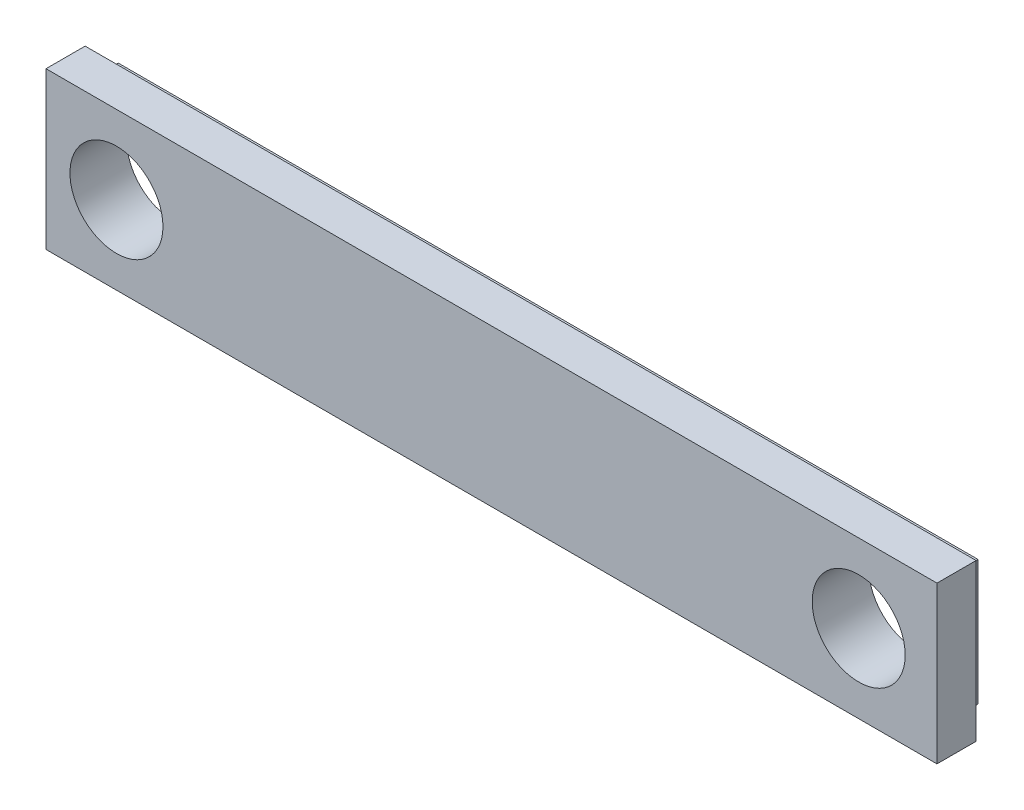
ISO-10303-21;
HEADER;
FILE_DESCRIPTION(('STEP AP214'),'2;1');
FILE_NAME('part.step','',(''),(''),'','','');
FILE_SCHEMA(('AUTOMOTIVE_DESIGN { 1 0 10303 214 1 1 1 1 }'));
ENDSEC;
DATA;
#1=APPLICATION_CONTEXT('core data for automotive mechanical design processes');
#2=APPLICATION_PROTOCOL_DEFINITION('international standard','automotive_design',2000,#1);
#3=PRODUCT_CONTEXT('',#1,'mechanical');
#4=PRODUCT('Part','Part','',(#3));
#5=PRODUCT_RELATED_PRODUCT_CATEGORY('part','',(#4));
#6=PRODUCT_DEFINITION_FORMATION('','',#4);
#7=PRODUCT_DEFINITION_CONTEXT('part definition',#1,'design');
#8=PRODUCT_DEFINITION('design','',#6,#7);
#9=PRODUCT_DEFINITION_SHAPE('','',#8);
#10=(LENGTH_UNIT() NAMED_UNIT(*) SI_UNIT(.MILLI.,.METRE.));
#11=(NAMED_UNIT(*) PLANE_ANGLE_UNIT() SI_UNIT($,.RADIAN.));
#12=(NAMED_UNIT(*) SI_UNIT($,.STERADIAN.) SOLID_ANGLE_UNIT());
#13=UNCERTAINTY_MEASURE_WITH_UNIT(LENGTH_MEASURE(1.E-05),#10,'distance_accuracy_value','');
#14=(GEOMETRIC_REPRESENTATION_CONTEXT(3) GLOBAL_UNCERTAINTY_ASSIGNED_CONTEXT((#13)) GLOBAL_UNIT_ASSIGNED_CONTEXT((#10,
#11,#12)) REPRESENTATION_CONTEXT('',''));
#15=CARTESIAN_POINT('',(0.,0.,0.));
#16=DIRECTION('',(0.,0.,1.));
#17=DIRECTION('',(1.,0.,0.));
#18=AXIS2_PLACEMENT_3D('',#15,#16,#17);
#19=CARTESIAN_POINT('',(0.,0.,0.));
#20=DIRECTION('',(0.,0.,-1.));
#21=DIRECTION('',(-1.,0.,0.));
#22=AXIS2_PLACEMENT_3D('',#19,#20,#21);
#23=PLANE('',#22);
#24=CARTESIAN_POINT('',(-165.899999999998,5.99999999999508,0.));
#25=DIRECTION('',(0.,0.,1.));
#26=DIRECTION('',(1.,0.,0.));
#27=AXIS2_PLACEMENT_3D('',#24,#25,#26);
#28=CIRCLE('',#27,2.96999999999999);
#29=CARTESIAN_POINT('',(-162.929999999998,5.99999999999508,0.));
#30=VERTEX_POINT('',#29);
#31=EDGE_CURVE('E185',#30,#30,#28,.T.);
#32=ORIENTED_EDGE('',*,*,#31,.T.);
#33=EDGE_LOOP('',(#32));
#34=FACE_BOUND('',#33,.T.);
#35=DIRECTION('',(0.,1.,0.));
#36=VECTOR('',#35,1.);
#37=CARTESIAN_POINT('',(-161.899999999997,9.99999999999508,0.));
#38=LINE('',#37,#36);
#39=CARTESIAN_POINT('',(-161.899999999997,2.00000000000389,0.));
#40=VERTEX_POINT('',#39);
#41=CARTESIAN_POINT('',(-161.899999999997,9.99999999999508,0.));
#42=VERTEX_POINT('',#41);
#43=EDGE_CURVE('E188',#40,#42,#38,.T.);
#44=ORIENTED_EDGE('',*,*,#43,.F.);
#45=DIRECTION('',(1.,0.,0.));
#46=VECTOR('',#45,1.);
#47=CARTESIAN_POINT('',(-161.899999999997,2.00000000000389,0.));
#48=LINE('',#47,#46);
#49=CARTESIAN_POINT('',(-216.799999999998,2.00000000000389,0.));
#50=VERTEX_POINT('',#49);
#51=EDGE_CURVE('E101',#50,#40,#48,.T.);
#52=ORIENTED_EDGE('',*,*,#51,.F.);
#53=DIRECTION('',(0.,-1.,0.));
#54=VECTOR('',#53,1.);
#55=CARTESIAN_POINT('',(-216.799999999998,9.99999999999504,0.));
#56=LINE('',#55,#54);
#57=CARTESIAN_POINT('',(-216.799999999998,9.99999999999504,0.));
#58=VERTEX_POINT('',#57);
#59=EDGE_CURVE('E96',#58,#50,#56,.T.);
#60=ORIENTED_EDGE('',*,*,#59,.F.);
#61=DIRECTION('',(-1.,0.,0.));
#62=VECTOR('',#61,1.);
#63=CARTESIAN_POINT('',(-161.899999999997,9.99999999999508,0.));
#64=LINE('',#63,#62);
#65=EDGE_CURVE('E202',#42,#58,#64,.T.);
#66=ORIENTED_EDGE('',*,*,#65,.F.);
#67=EDGE_LOOP('',(#44,#52,#60,#66));
#68=FACE_BOUND('',#67,.T.);
#69=CARTESIAN_POINT('',(-213.299999999998,6.00000000000389,0.));
#70=DIRECTION('',(0.,0.,1.));
#71=DIRECTION('',(1.,0.,0.));
#72=AXIS2_PLACEMENT_3D('',#69,#70,#71);
#73=CIRCLE('',#72,2.969999999997);
#74=CARTESIAN_POINT('',(-210.330000000001,6.00000000000389,0.));
#75=VERTEX_POINT('',#74);
#76=EDGE_CURVE('E178',#75,#75,#73,.T.);
#77=ORIENTED_EDGE('',*,*,#76,.T.);
#78=EDGE_LOOP('',(#77));
#79=FACE_BOUND('',#78,.T.);
#80=ADVANCED_FACE('F63',(#34,#68,#79),#23,.T.);
#81=CARTESIAN_POINT('',(-161.899999999997,9.99999999999508,1.12));
#82=DIRECTION('',(-1.,0.,0.));
#83=DIRECTION('',(0.,0.,1.));
#84=AXIS2_PLACEMENT_3D('',#81,#82,#83);
#85=PLANE('',#84);
#86=ORIENTED_EDGE('',*,*,#43,.T.);
#87=DIRECTION('',(0.,0.,-1.));
#88=VECTOR('',#87,1.);
#89=CARTESIAN_POINT('',(-161.899999999997,9.99999999999508,1.12));
#90=LINE('',#89,#88);
#91=CARTESIAN_POINT('',(-161.899999999997,9.99999999999508,1.12));
#92=VERTEX_POINT('',#91);
#93=EDGE_CURVE('E12',#92,#42,#90,.T.);
#94=ORIENTED_EDGE('',*,*,#93,.F.);
#95=DIRECTION('',(0.,1.,0.));
#96=VECTOR('',#95,1.);
#97=CARTESIAN_POINT('',(-161.899999999997,9.99999999999508,1.12));
#98=LINE('',#97,#96);
#99=CARTESIAN_POINT('',(-161.899999999997,2.00000000000389,1.12));
#100=VERTEX_POINT('',#99);
#101=EDGE_CURVE('E189',#100,#92,#98,.T.);
#102=ORIENTED_EDGE('',*,*,#101,.F.);
#103=DIRECTION('',(0.,0.,-1.));
#104=VECTOR('',#103,1.);
#105=CARTESIAN_POINT('',(-161.899999999997,2.00000000000389,1.12));
#106=LINE('',#105,#104);
#107=EDGE_CURVE('E199',#100,#40,#106,.T.);
#108=ORIENTED_EDGE('',*,*,#107,.T.);
#109=EDGE_LOOP('',(#86,#94,#102,#108));
#110=FACE_BOUND('',#109,.T.);
#111=ADVANCED_FACE('F65',(#110),#85,.F.);
#112=CARTESIAN_POINT('',(-161.899999999997,9.99999999999508,1.12));
#113=DIRECTION('',(0.,-1.,0.));
#114=DIRECTION('',(1.,0.,0.));
#115=AXIS2_PLACEMENT_3D('',#112,#113,#114);
#116=PLANE('',#115);
#117=ORIENTED_EDGE('',*,*,#65,.T.);
#118=DIRECTION('',(0.,0.,-1.));
#119=VECTOR('',#118,1.);
#120=CARTESIAN_POINT('',(-216.799999999998,9.99999999999504,1.12));
#121=LINE('',#120,#119);
#122=CARTESIAN_POINT('',(-216.799999999998,9.99999999999504,1.12));
#123=VERTEX_POINT('',#122);
#124=EDGE_CURVE('E72',#123,#58,#121,.T.);
#125=ORIENTED_EDGE('',*,*,#124,.F.);
#126=DIRECTION('',(-1.,0.,0.));
#127=VECTOR('',#126,1.);
#128=CARTESIAN_POINT('',(-161.899999999997,9.99999999999508,1.12));
#129=LINE('',#128,#127);
#130=EDGE_CURVE('E106',#92,#123,#129,.T.);
#131=ORIENTED_EDGE('',*,*,#130,.F.);
#132=ORIENTED_EDGE('',*,*,#93,.T.);
#133=EDGE_LOOP('',(#117,#125,#131,#132));
#134=FACE_BOUND('',#133,.T.);
#135=ADVANCED_FACE('F239',(#134),#116,.F.);
#136=CARTESIAN_POINT('',(-216.799999999998,9.99999999999504,1.12));
#137=DIRECTION('',(1.,0.,0.));
#138=DIRECTION('',(0.,0.,-1.));
#139=AXIS2_PLACEMENT_3D('',#136,#137,#138);
#140=PLANE('',#139);
#141=ORIENTED_EDGE('',*,*,#59,.T.);
#142=DIRECTION('',(0.,0.,-1.));
#143=VECTOR('',#142,1.);
#144=CARTESIAN_POINT('',(-216.799999999998,2.00000000000389,1.12));
#145=LINE('',#144,#143);
#146=CARTESIAN_POINT('',(-216.799999999998,2.00000000000389,1.12));
#147=VERTEX_POINT('',#146);
#148=EDGE_CURVE('E80',#147,#50,#145,.T.);
#149=ORIENTED_EDGE('',*,*,#148,.F.);
#150=DIRECTION('',(0.,-1.,0.));
#151=VECTOR('',#150,1.);
#152=CARTESIAN_POINT('',(-216.799999999998,9.99999999999504,1.12));
#153=LINE('',#152,#151);
#154=EDGE_CURVE('E193',#123,#147,#153,.T.);
#155=ORIENTED_EDGE('',*,*,#154,.F.);
#156=ORIENTED_EDGE('',*,*,#124,.T.);
#157=EDGE_LOOP('',(#141,#149,#155,#156));
#158=FACE_BOUND('',#157,.T.);
#159=ADVANCED_FACE('F207',(#158),#140,.F.);
#160=CARTESIAN_POINT('',(-161.899999999997,2.00000000000389,1.12));
#161=DIRECTION('',(0.,1.,0.));
#162=DIRECTION('',(-1.,0.,0.));
#163=AXIS2_PLACEMENT_3D('',#160,#161,#162);
#164=PLANE('',#163);
#165=ORIENTED_EDGE('',*,*,#51,.T.);
#166=ORIENTED_EDGE('',*,*,#107,.F.);
#167=DIRECTION('',(1.,0.,0.));
#168=VECTOR('',#167,1.);
#169=CARTESIAN_POINT('',(-161.899999999997,2.00000000000389,1.12));
#170=LINE('',#169,#168);
#171=EDGE_CURVE('E196',#147,#100,#170,.T.);
#172=ORIENTED_EDGE('',*,*,#171,.F.);
#173=ORIENTED_EDGE('',*,*,#148,.T.);
#174=EDGE_LOOP('',(#165,#166,#172,#173));
#175=FACE_BOUND('',#174,.T.);
#176=ADVANCED_FACE('F212',(#175),#164,.F.);
#177=CARTESIAN_POINT('',(-165.899999999998,5.99999999999508,1.12));
#178=DIRECTION('',(0.,0.,-1.));
#179=DIRECTION('',(-1.,0.,0.));
#180=AXIS2_PLACEMENT_3D('',#177,#178,#179);
#181=CYLINDRICAL_SURFACE('',#180,2.96999999999999);
#182=ORIENTED_EDGE('',*,*,#31,.F.);
#183=EDGE_LOOP('',(#182));
#184=FACE_BOUND('',#183,.T.);
#185=CARTESIAN_POINT('',(-165.899999999998,5.99999999999508,3.62));
#186=DIRECTION('',(0.,0.,1.));
#187=DIRECTION('',(1.,0.,0.));
#188=AXIS2_PLACEMENT_3D('',#185,#186,#187);
#189=CIRCLE('',#188,2.969999999997);
#190=CARTESIAN_POINT('',(-162.93,5.99999999999508,3.62));
#191=VERTEX_POINT('',#190);
#192=EDGE_CURVE('E341',#191,#191,#189,.T.);
#193=ORIENTED_EDGE('',*,*,#192,.T.);
#194=EDGE_LOOP('',(#193));
#195=FACE_BOUND('',#194,.T.);
#196=ADVANCED_FACE('F242',(#184,#195),#181,.F.);
#197=CARTESIAN_POINT('',(-213.299999999998,6.00000000000389,1.12));
#198=DIRECTION('',(0.,0.,-1.));
#199=DIRECTION('',(-1.,0.,0.));
#200=AXIS2_PLACEMENT_3D('',#197,#198,#199);
#201=CYLINDRICAL_SURFACE('',#200,2.969999999997);
#202=ORIENTED_EDGE('',*,*,#76,.F.);
#203=EDGE_LOOP('',(#202));
#204=FACE_BOUND('',#203,.T.);
#205=CARTESIAN_POINT('',(-213.299999999998,6.00000000000389,3.62));
#206=DIRECTION('',(0.,0.,1.));
#207=DIRECTION('',(1.,0.,0.));
#208=AXIS2_PLACEMENT_3D('',#205,#206,#207);
#209=CIRCLE('',#208,2.96999999999999);
#210=CARTESIAN_POINT('',(-210.329999999998,6.00000000000389,3.62));
#211=VERTEX_POINT('',#210);
#212=EDGE_CURVE('E167',#211,#211,#209,.T.);
#213=ORIENTED_EDGE('',*,*,#212,.T.);
#214=EDGE_LOOP('',(#213));
#215=FACE_BOUND('',#214,.T.);
#216=ADVANCED_FACE('F266',(#204,#215),#201,.F.);
#217=CARTESIAN_POINT('',(0.,0.,3.62));
#218=DIRECTION('',(0.,0.,-1.));
#219=DIRECTION('',(-1.,0.,0.));
#220=AXIS2_PLACEMENT_3D('',#217,#218,#219);
#221=PLANE('',#220);
#222=DIRECTION('',(0.,-1.,0.));
#223=VECTOR('',#222,1.);
#224=CARTESIAN_POINT('',(-160.899999999997,10.9999999999951,3.62));
#225=LINE('',#224,#223);
#226=CARTESIAN_POINT('',(-160.899999999997,10.9999999999951,3.62));
#227=VERTEX_POINT('',#226);
#228=CARTESIAN_POINT('',(-160.899999999997,1.00000000000389,3.62));
#229=VERTEX_POINT('',#228);
#230=EDGE_CURVE('E154',#227,#229,#225,.T.);
#231=ORIENTED_EDGE('',*,*,#230,.F.);
#232=DIRECTION('',(-1.,0.,0.));
#233=VECTOR('',#232,1.);
#234=CARTESIAN_POINT('',(-160.899999999997,10.9999999999951,3.62));
#235=LINE('',#234,#233);
#236=CARTESIAN_POINT('',(-217.799999999998,10.9999999999951,3.62));
#237=VERTEX_POINT('',#236);
#238=EDGE_CURVE('E148',#227,#237,#235,.T.);
#239=ORIENTED_EDGE('',*,*,#238,.T.);
#240=DIRECTION('',(0.,-1.,0.));
#241=VECTOR('',#240,1.);
#242=CARTESIAN_POINT('',(-217.799999999998,10.9999999999951,3.62));
#243=LINE('',#242,#241);
#244=CARTESIAN_POINT('',(-217.799999999998,1.00000000000389,3.62));
#245=VERTEX_POINT('',#244);
#246=EDGE_CURVE('E156',#237,#245,#243,.T.);
#247=ORIENTED_EDGE('',*,*,#246,.T.);
#248=DIRECTION('',(-1.,0.,0.));
#249=VECTOR('',#248,1.);
#250=CARTESIAN_POINT('',(-160.899999999997,1.00000000000389,3.62));
#251=LINE('',#250,#249);
#252=EDGE_CURVE('E140',#229,#245,#251,.T.);
#253=ORIENTED_EDGE('',*,*,#252,.F.);
#254=EDGE_LOOP('',(#231,#239,#247,#253));
#255=FACE_BOUND('',#254,.T.);
#256=ORIENTED_EDGE('',*,*,#212,.F.);
#257=EDGE_LOOP('',(#256));
#258=FACE_BOUND('',#257,.T.);
#259=ORIENTED_EDGE('',*,*,#192,.F.);
#260=EDGE_LOOP('',(#259));
#261=FACE_BOUND('',#260,.T.);
#262=ADVANCED_FACE('F152',(#255,#258,#261),#221,.F.);
#263=CARTESIAN_POINT('',(0.,0.,1.12));
#264=DIRECTION('',(0.,0.,-1.));
#265=DIRECTION('',(-1.,0.,0.));
#266=AXIS2_PLACEMENT_3D('',#263,#264,#265);
#267=PLANE('',#266);
#268=ORIENTED_EDGE('',*,*,#171,.T.);
#269=ORIENTED_EDGE('',*,*,#101,.T.);
#270=ORIENTED_EDGE('',*,*,#130,.T.);
#271=ORIENTED_EDGE('',*,*,#154,.T.);
#272=EDGE_LOOP('',(#268,#269,#270,#271));
#273=FACE_BOUND('',#272,.T.);
#274=DIRECTION('',(0.,-1.,0.));
#275=VECTOR('',#274,1.);
#276=CARTESIAN_POINT('',(-160.899999999997,10.9999999999951,1.12));
#277=LINE('',#276,#275);
#278=CARTESIAN_POINT('',(-160.899999999997,10.9999999999951,1.12));
#279=VERTEX_POINT('',#278);
#280=CARTESIAN_POINT('',(-160.899999999997,1.00000000000389,1.12));
#281=VERTEX_POINT('',#280);
#282=EDGE_CURVE('E172',#279,#281,#277,.T.);
#283=ORIENTED_EDGE('',*,*,#282,.T.);
#284=DIRECTION('',(-1.,0.,0.));
#285=VECTOR('',#284,1.);
#286=CARTESIAN_POINT('',(-160.899999999997,1.00000000000389,1.12));
#287=LINE('',#286,#285);
#288=CARTESIAN_POINT('',(-217.799999999998,1.00000000000389,1.12));
#289=VERTEX_POINT('',#288);
#290=EDGE_CURVE('E142',#281,#289,#287,.T.);
#291=ORIENTED_EDGE('',*,*,#290,.T.);
#292=DIRECTION('',(0.,-1.,0.));
#293=VECTOR('',#292,1.);
#294=CARTESIAN_POINT('',(-217.799999999998,10.9999999999951,1.12));
#295=LINE('',#294,#293);
#296=CARTESIAN_POINT('',(-217.799999999998,10.9999999999951,1.12));
#297=VERTEX_POINT('',#296);
#298=EDGE_CURVE('E164',#297,#289,#295,.T.);
#299=ORIENTED_EDGE('',*,*,#298,.F.);
#300=DIRECTION('',(-1.,0.,0.));
#301=VECTOR('',#300,1.);
#302=CARTESIAN_POINT('',(-160.899999999997,10.9999999999951,1.12));
#303=LINE('',#302,#301);
#304=EDGE_CURVE('E162',#279,#297,#303,.T.);
#305=ORIENTED_EDGE('',*,*,#304,.F.);
#306=EDGE_LOOP('',(#283,#291,#299,#305));
#307=FACE_BOUND('',#306,.T.);
#308=ADVANCED_FACE('F214',(#273,#307),#267,.T.);
#309=CARTESIAN_POINT('',(-160.899999999997,10.9999999999951,3.62));
#310=DIRECTION('',(1.,0.,0.));
#311=DIRECTION('',(0.,0.,-1.));
#312=AXIS2_PLACEMENT_3D('',#309,#310,#311);
#313=PLANE('',#312);
#314=ORIENTED_EDGE('',*,*,#282,.F.);
#315=DIRECTION('',(0.,0.,-1.));
#316=VECTOR('',#315,1.);
#317=CARTESIAN_POINT('',(-160.899999999997,10.9999999999951,3.62));
#318=LINE('',#317,#316);
#319=EDGE_CURVE('E160',#227,#279,#318,.T.);
#320=ORIENTED_EDGE('',*,*,#319,.F.);
#321=ORIENTED_EDGE('',*,*,#230,.T.);
#322=DIRECTION('',(0.,0.,-1.));
#323=VECTOR('',#322,1.);
#324=CARTESIAN_POINT('',(-160.899999999997,1.00000000000389,3.62));
#325=LINE('',#324,#323);
#326=EDGE_CURVE('E137',#229,#281,#325,.T.);
#327=ORIENTED_EDGE('',*,*,#326,.T.);
#328=EDGE_LOOP('',(#314,#320,#321,#327));
#329=FACE_BOUND('',#328,.T.);
#330=ADVANCED_FACE('F159',(#329),#313,.T.);
#331=CARTESIAN_POINT('',(-160.899999999997,10.9999999999951,3.62));
#332=DIRECTION('',(0.,-1.,0.));
#333=DIRECTION('',(1.,0.,0.));
#334=AXIS2_PLACEMENT_3D('',#331,#332,#333);
#335=PLANE('',#334);
#336=ORIENTED_EDGE('',*,*,#304,.T.);
#337=DIRECTION('',(0.,0.,-1.));
#338=VECTOR('',#337,1.);
#339=CARTESIAN_POINT('',(-217.799999999998,10.9999999999951,3.62));
#340=LINE('',#339,#338);
#341=EDGE_CURVE('E179',#237,#297,#340,.T.);
#342=ORIENTED_EDGE('',*,*,#341,.F.);
#343=ORIENTED_EDGE('',*,*,#238,.F.);
#344=ORIENTED_EDGE('',*,*,#319,.T.);
#345=EDGE_LOOP('',(#336,#342,#343,#344));
#346=FACE_BOUND('',#345,.T.);
#347=ADVANCED_FACE('F222',(#346),#335,.F.);
#348=CARTESIAN_POINT('',(-217.799999999998,10.9999999999951,3.62));
#349=DIRECTION('',(1.,0.,0.));
#350=DIRECTION('',(0.,0.,-1.));
#351=AXIS2_PLACEMENT_3D('',#348,#349,#350);
#352=PLANE('',#351);
#353=ORIENTED_EDGE('',*,*,#298,.T.);
#354=DIRECTION('',(0.,0.,-1.));
#355=VECTOR('',#354,1.);
#356=CARTESIAN_POINT('',(-217.799999999998,1.00000000000389,3.62));
#357=LINE('',#356,#355);
#358=EDGE_CURVE('E147',#245,#289,#357,.T.);
#359=ORIENTED_EDGE('',*,*,#358,.F.);
#360=ORIENTED_EDGE('',*,*,#246,.F.);
#361=ORIENTED_EDGE('',*,*,#341,.T.);
#362=EDGE_LOOP('',(#353,#359,#360,#361));
#363=FACE_BOUND('',#362,.T.);
#364=ADVANCED_FACE('F224',(#363),#352,.F.);
#365=CARTESIAN_POINT('',(-160.899999999997,1.00000000000389,3.62));
#366=DIRECTION('',(0.,-1.,0.));
#367=DIRECTION('',(1.,0.,0.));
#368=AXIS2_PLACEMENT_3D('',#365,#366,#367);
#369=PLANE('',#368);
#370=ORIENTED_EDGE('',*,*,#290,.F.);
#371=ORIENTED_EDGE('',*,*,#326,.F.);
#372=ORIENTED_EDGE('',*,*,#252,.T.);
#373=ORIENTED_EDGE('',*,*,#358,.T.);
#374=EDGE_LOOP('',(#370,#371,#372,#373));
#375=FACE_BOUND('',#374,.T.);
#376=ADVANCED_FACE('F139',(#375),#369,.T.);
#377=CLOSED_SHELL('',(#80,#111,#135,#159,#176,#196,#216,#262,#308,#330,#347,#364,#376));
#378=MANIFOLD_SOLID_BREP('B2',#377);
#379=ADVANCED_BREP_SHAPE_REPRESENTATION('',(#18,#378),#14);
#380=SHAPE_DEFINITION_REPRESENTATION(#9,#379);
ENDSEC;
END-ISO-10303-21;
